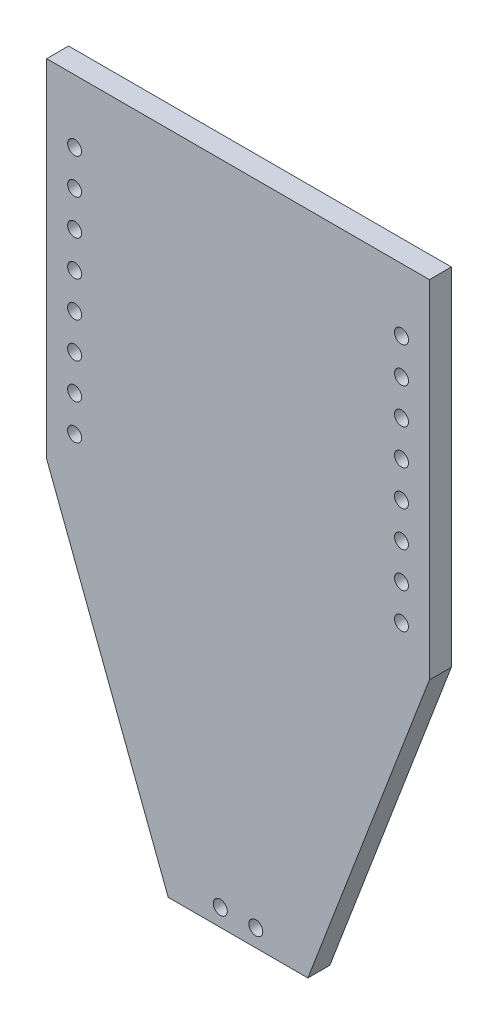
ISO-10303-21;
HEADER;
FILE_DESCRIPTION(('STEP AP214'),'2;1');
FILE_NAME('part.step','',(''),(''),'','','');
FILE_SCHEMA(('AUTOMOTIVE_DESIGN { 1 0 10303 214 1 1 1 1 }'));
ENDSEC;
DATA;
#1=APPLICATION_CONTEXT('core data for automotive mechanical design processes');
#2=APPLICATION_PROTOCOL_DEFINITION('international standard','automotive_design',2000,#1);
#3=PRODUCT_CONTEXT('',#1,'mechanical');
#4=PRODUCT('Part','Part','',(#3));
#5=PRODUCT_RELATED_PRODUCT_CATEGORY('part','',(#4));
#6=PRODUCT_DEFINITION_FORMATION('','',#4);
#7=PRODUCT_DEFINITION_CONTEXT('part definition',#1,'design');
#8=PRODUCT_DEFINITION('design','',#6,#7);
#9=PRODUCT_DEFINITION_SHAPE('','',#8);
#10=(LENGTH_UNIT() NAMED_UNIT(*) SI_UNIT(.MILLI.,.METRE.));
#11=(NAMED_UNIT(*) PLANE_ANGLE_UNIT() SI_UNIT($,.RADIAN.));
#12=(NAMED_UNIT(*) SI_UNIT($,.STERADIAN.) SOLID_ANGLE_UNIT());
#13=UNCERTAINTY_MEASURE_WITH_UNIT(LENGTH_MEASURE(1.E-05),#10,'distance_accuracy_value','');
#14=(GEOMETRIC_REPRESENTATION_CONTEXT(3) GLOBAL_UNCERTAINTY_ASSIGNED_CONTEXT((#13)) GLOBAL_UNIT_ASSIGNED_CONTEXT((#10,
#11,#12)) REPRESENTATION_CONTEXT('',''));
#15=CARTESIAN_POINT('',(0.,0.,0.));
#16=DIRECTION('',(0.,0.,1.));
#17=DIRECTION('',(1.,0.,0.));
#18=AXIS2_PLACEMENT_3D('',#15,#16,#17);
#19=CARTESIAN_POINT('',(0.,-27.8,1.57));
#20=DIRECTION('',(0.,1.,0.));
#21=DIRECTION('',(0.,0.,1.));
#22=AXIS2_PLACEMENT_3D('',#19,#20,#21);
#23=PLANE('',#22);
#24=DIRECTION('',(1.,0.,0.));
#25=VECTOR('',#24,1.);
#26=CARTESIAN_POINT('',(0.,-27.8,0.));
#27=LINE('',#26,#25);
#28=CARTESIAN_POINT('',(-5.,-27.8,0.));
#29=VERTEX_POINT('',#28);
#30=CARTESIAN_POINT('',(5.00000000000001,-27.8,0.));
#31=VERTEX_POINT('',#30);
#32=EDGE_CURVE('E179',#29,#31,#27,.T.);
#33=ORIENTED_EDGE('',*,*,#32,.T.);
#34=DIRECTION('',(0.,0.,-1.));
#35=VECTOR('',#34,1.);
#36=CARTESIAN_POINT('',(5.00000000000001,-27.8,1.57));
#37=LINE('',#36,#35);
#38=CARTESIAN_POINT('',(5.00000000000001,-27.8,1.57));
#39=VERTEX_POINT('',#38);
#40=EDGE_CURVE('E11',#39,#31,#37,.T.);
#41=ORIENTED_EDGE('',*,*,#40,.F.);
#42=DIRECTION('',(1.,0.,0.));
#43=VECTOR('',#42,1.);
#44=CARTESIAN_POINT('',(0.,-27.8,1.57));
#45=LINE('',#44,#43);
#46=CARTESIAN_POINT('',(-5.,-27.8,1.57));
#47=VERTEX_POINT('',#46);
#48=EDGE_CURVE('E244',#47,#39,#45,.T.);
#49=ORIENTED_EDGE('',*,*,#48,.F.);
#50=DIRECTION('',(0.,0.,-1.));
#51=VECTOR('',#50,1.);
#52=CARTESIAN_POINT('',(-5.,-27.8,1.57));
#53=LINE('',#52,#51);
#54=EDGE_CURVE('E178',#47,#29,#53,.T.);
#55=ORIENTED_EDGE('',*,*,#54,.T.);
#56=EDGE_LOOP('',(#33,#41,#49,#55));
#57=FACE_BOUND('',#56,.T.);
#58=ADVANCED_FACE('F41',(#57),#23,.F.);
#59=CARTESIAN_POINT('',(13.6165576783606,-5.18896416126752,1.57));
#60=DIRECTION('',(-0.934448824881694,0.356097449692104,0.));
#61=DIRECTION('',(-0.356097449692104,-0.934448824881694,0.));
#62=AXIS2_PLACEMENT_3D('',#59,#60,#61);
#63=PLANE('',#62);
#64=DIRECTION('',(0.356097449692104,0.934448824881694,0.));
#65=VECTOR('',#64,1.);
#66=CARTESIAN_POINT('',(13.6165576783606,-5.18896416126752,0.));
#67=LINE('',#66,#65);
#68=CARTESIAN_POINT('',(13.7,-4.97000000000002,0.));
#69=VERTEX_POINT('',#68);
#70=EDGE_CURVE('E182',#31,#69,#67,.T.);
#71=ORIENTED_EDGE('',*,*,#70,.T.);
#72=DIRECTION('',(0.,0.,-1.));
#73=VECTOR('',#72,1.);
#74=CARTESIAN_POINT('',(13.7,-4.97000000000002,1.57));
#75=LINE('',#74,#73);
#76=CARTESIAN_POINT('',(13.7,-4.97000000000002,1.57));
#77=VERTEX_POINT('',#76);
#78=EDGE_CURVE('E49',#77,#69,#75,.T.);
#79=ORIENTED_EDGE('',*,*,#78,.F.);
#80=DIRECTION('',(0.356097449692104,0.934448824881694,0.));
#81=VECTOR('',#80,1.);
#82=CARTESIAN_POINT('',(13.6165576783606,-5.18896416126752,1.57));
#83=LINE('',#82,#81);
#84=EDGE_CURVE('E90',#39,#77,#83,.T.);
#85=ORIENTED_EDGE('',*,*,#84,.F.);
#86=ORIENTED_EDGE('',*,*,#40,.T.);
#87=EDGE_LOOP('',(#71,#79,#85,#86));
#88=FACE_BOUND('',#87,.T.);
#89=ADVANCED_FACE('F274',(#88),#63,.F.);
#90=CARTESIAN_POINT('',(13.7,0.,1.57));
#91=DIRECTION('',(-1.,0.,0.));
#92=DIRECTION('',(0.,0.,1.));
#93=AXIS2_PLACEMENT_3D('',#90,#91,#92);
#94=PLANE('',#93);
#95=DIRECTION('',(0.,1.,0.));
#96=VECTOR('',#95,1.);
#97=CARTESIAN_POINT('',(13.7,0.,0.));
#98=LINE('',#97,#96);
#99=CARTESIAN_POINT('',(13.7,19.85,0.));
#100=VERTEX_POINT('',#99);
#101=EDGE_CURVE('E184',#69,#100,#98,.T.);
#102=ORIENTED_EDGE('',*,*,#101,.T.);
#103=DIRECTION('',(0.,0.,-1.));
#104=VECTOR('',#103,1.);
#105=CARTESIAN_POINT('',(13.7,19.85,1.57));
#106=LINE('',#105,#104);
#107=CARTESIAN_POINT('',(13.7,19.85,1.57));
#108=VERTEX_POINT('',#107);
#109=EDGE_CURVE('E117',#108,#100,#106,.T.);
#110=ORIENTED_EDGE('',*,*,#109,.F.);
#111=DIRECTION('',(0.,1.,0.));
#112=VECTOR('',#111,1.);
#113=CARTESIAN_POINT('',(13.7,0.,1.57));
#114=LINE('',#113,#112);
#115=EDGE_CURVE('E104',#77,#108,#114,.T.);
#116=ORIENTED_EDGE('',*,*,#115,.F.);
#117=ORIENTED_EDGE('',*,*,#78,.T.);
#118=EDGE_LOOP('',(#102,#110,#116,#117));
#119=FACE_BOUND('',#118,.T.);
#120=ADVANCED_FACE('F250',(#119),#94,.F.);
#121=CARTESIAN_POINT('',(0.,19.85,1.57));
#122=DIRECTION('',(0.,-1.,0.));
#123=DIRECTION('',(1.,0.,0.));
#124=AXIS2_PLACEMENT_3D('',#121,#122,#123);
#125=PLANE('',#124);
#126=DIRECTION('',(-1.,0.,0.));
#127=VECTOR('',#126,1.);
#128=CARTESIAN_POINT('',(0.,19.85,0.));
#129=LINE('',#128,#127);
#130=CARTESIAN_POINT('',(-13.7,19.85,0.));
#131=VERTEX_POINT('',#130);
#132=EDGE_CURVE('E113',#100,#131,#129,.T.);
#133=ORIENTED_EDGE('',*,*,#132,.T.);
#134=DIRECTION('',(0.,0.,-1.));
#135=VECTOR('',#134,1.);
#136=CARTESIAN_POINT('',(-13.7,19.85,1.57));
#137=LINE('',#136,#135);
#138=CARTESIAN_POINT('',(-13.7,19.85,1.57));
#139=VERTEX_POINT('',#138);
#140=EDGE_CURVE('E110',#139,#131,#137,.T.);
#141=ORIENTED_EDGE('',*,*,#140,.F.);
#142=DIRECTION('',(-1.,0.,0.));
#143=VECTOR('',#142,1.);
#144=CARTESIAN_POINT('',(0.,19.85,1.57));
#145=LINE('',#144,#143);
#146=EDGE_CURVE('E97',#108,#139,#145,.T.);
#147=ORIENTED_EDGE('',*,*,#146,.F.);
#148=ORIENTED_EDGE('',*,*,#109,.T.);
#149=EDGE_LOOP('',(#133,#141,#147,#148));
#150=FACE_BOUND('',#149,.T.);
#151=ADVANCED_FACE('F111',(#150),#125,.F.);
#152=CARTESIAN_POINT('',(-13.7,0.,1.57));
#153=DIRECTION('',(-1.,0.,0.));
#154=DIRECTION('',(0.,0.,1.));
#155=AXIS2_PLACEMENT_3D('',#152,#153,#154);
#156=PLANE('',#155);
#157=DIRECTION('',(0.,1.,0.));
#158=VECTOR('',#157,1.);
#159=CARTESIAN_POINT('',(-13.7,0.,0.));
#160=LINE('',#159,#158);
#161=CARTESIAN_POINT('',(-13.7,-4.97000000000002,0.));
#162=VERTEX_POINT('',#161);
#163=EDGE_CURVE('E187',#162,#131,#160,.T.);
#164=ORIENTED_EDGE('',*,*,#163,.F.);
#165=DIRECTION('',(0.,0.,-1.));
#166=VECTOR('',#165,1.);
#167=CARTESIAN_POINT('',(-13.7,-4.97000000000002,1.57));
#168=LINE('',#167,#166);
#169=CARTESIAN_POINT('',(-13.7,-4.97000000000002,1.57));
#170=VERTEX_POINT('',#169);
#171=EDGE_CURVE('E79',#170,#162,#168,.T.);
#172=ORIENTED_EDGE('',*,*,#171,.F.);
#173=DIRECTION('',(0.,1.,0.));
#174=VECTOR('',#173,1.);
#175=CARTESIAN_POINT('',(-13.7,0.,1.57));
#176=LINE('',#175,#174);
#177=EDGE_CURVE('E102',#170,#139,#176,.T.);
#178=ORIENTED_EDGE('',*,*,#177,.T.);
#179=ORIENTED_EDGE('',*,*,#140,.T.);
#180=EDGE_LOOP('',(#164,#172,#178,#179));
#181=FACE_BOUND('',#180,.T.);
#182=ADVANCED_FACE('F119',(#181),#156,.T.);
#183=CARTESIAN_POINT('',(1.27000000000001,-26.55,1.57));
#184=DIRECTION('',(0.,0.,-1.));
#185=DIRECTION('',(-1.,0.,0.));
#186=AXIS2_PLACEMENT_3D('',#183,#184,#185);
#187=CYLINDRICAL_SURFACE('',#186,0.5);
#188=CARTESIAN_POINT('',(1.27000000000001,-26.55,1.57));
#189=DIRECTION('',(0.,0.,1.));
#190=DIRECTION('',(1.,0.,0.));
#191=AXIS2_PLACEMENT_3D('',#188,#189,#190);
#192=CIRCLE('',#191,0.5);
#193=CARTESIAN_POINT('',(1.77000000000001,-26.55,1.57));
#194=VERTEX_POINT('',#193);
#195=EDGE_CURVE('E172',#194,#194,#192,.T.);
#196=ORIENTED_EDGE('',*,*,#195,.T.);
#197=EDGE_LOOP('',(#196));
#198=FACE_BOUND('',#197,.T.);
#199=CARTESIAN_POINT('',(1.27000000000001,-26.55,0.));
#200=DIRECTION('',(0.,0.,1.));
#201=DIRECTION('',(1.,0.,0.));
#202=AXIS2_PLACEMENT_3D('',#199,#200,#201);
#203=CIRCLE('',#202,0.5);
#204=CARTESIAN_POINT('',(1.77000000000001,-26.55,0.));
#205=VERTEX_POINT('',#204);
#206=EDGE_CURVE('E238',#205,#205,#203,.T.);
#207=ORIENTED_EDGE('',*,*,#206,.F.);
#208=EDGE_LOOP('',(#207));
#209=FACE_BOUND('',#208,.T.);
#210=ADVANCED_FACE('F285',(#198,#209),#187,.F.);
#211=CARTESIAN_POINT('',(11.7,15.35,1.57));
#212=DIRECTION('',(0.,0.,-1.));
#213=DIRECTION('',(-1.,0.,0.));
#214=AXIS2_PLACEMENT_3D('',#211,#212,#213);
#215=CYLINDRICAL_SURFACE('',#214,0.500000000000001);
#216=CARTESIAN_POINT('',(11.7,15.35,1.57));
#217=DIRECTION('',(0.,0.,1.));
#218=DIRECTION('',(1.,0.,0.));
#219=AXIS2_PLACEMENT_3D('',#216,#217,#218);
#220=CIRCLE('',#219,0.500000000000001);
#221=CARTESIAN_POINT('',(12.2,15.35,1.57));
#222=VERTEX_POINT('',#221);
#223=EDGE_CURVE('E169',#222,#222,#220,.F.);
#224=ORIENTED_EDGE('',*,*,#223,.F.);
#225=EDGE_LOOP('',(#224));
#226=FACE_BOUND('',#225,.T.);
#227=CARTESIAN_POINT('',(11.7,15.35,0.));
#228=DIRECTION('',(0.,0.,1.));
#229=DIRECTION('',(1.,0.,0.));
#230=AXIS2_PLACEMENT_3D('',#227,#228,#229);
#231=CIRCLE('',#230,0.500000000000001);
#232=CARTESIAN_POINT('',(12.2,15.35,0.));
#233=VERTEX_POINT('',#232);
#234=EDGE_CURVE('E235',#233,#233,#231,.F.);
#235=ORIENTED_EDGE('',*,*,#234,.T.);
#236=EDGE_LOOP('',(#235));
#237=FACE_BOUND('',#236,.T.);
#238=ADVANCED_FACE('F289',(#226,#237),#215,.F.);
#239=CARTESIAN_POINT('',(11.7,10.27,1.57));
#240=DIRECTION('',(0.,0.,-1.));
#241=DIRECTION('',(-1.,0.,0.));
#242=AXIS2_PLACEMENT_3D('',#239,#240,#241);
#243=CYLINDRICAL_SURFACE('',#242,0.500000000000001);
#244=CARTESIAN_POINT('',(11.7,10.27,1.57));
#245=DIRECTION('',(0.,0.,1.));
#246=DIRECTION('',(1.,0.,0.));
#247=AXIS2_PLACEMENT_3D('',#244,#245,#246);
#248=CIRCLE('',#247,0.500000000000001);
#249=CARTESIAN_POINT('',(12.2,10.27,1.57));
#250=VERTEX_POINT('',#249);
#251=EDGE_CURVE('E166',#250,#250,#248,.F.);
#252=ORIENTED_EDGE('',*,*,#251,.F.);
#253=EDGE_LOOP('',(#252));
#254=FACE_BOUND('',#253,.T.);
#255=CARTESIAN_POINT('',(11.7,10.27,0.));
#256=DIRECTION('',(0.,0.,1.));
#257=DIRECTION('',(1.,0.,0.));
#258=AXIS2_PLACEMENT_3D('',#255,#256,#257);
#259=CIRCLE('',#258,0.500000000000001);
#260=CARTESIAN_POINT('',(12.2,10.27,0.));
#261=VERTEX_POINT('',#260);
#262=EDGE_CURVE('E232',#261,#261,#259,.F.);
#263=ORIENTED_EDGE('',*,*,#262,.T.);
#264=EDGE_LOOP('',(#263));
#265=FACE_BOUND('',#264,.T.);
#266=ADVANCED_FACE('F295',(#254,#265),#243,.F.);
#267=CARTESIAN_POINT('',(11.6999999999999,5.19,1.57));
#268=DIRECTION('',(0.,0.,-1.));
#269=DIRECTION('',(-1.,0.,0.));
#270=AXIS2_PLACEMENT_3D('',#267,#268,#269);
#271=CYLINDRICAL_SURFACE('',#270,0.500000000000001);
#272=CARTESIAN_POINT('',(11.6999999999999,5.19,1.57));
#273=DIRECTION('',(0.,0.,1.));
#274=DIRECTION('',(1.,0.,0.));
#275=AXIS2_PLACEMENT_3D('',#272,#273,#274);
#276=CIRCLE('',#275,0.500000000000001);
#277=CARTESIAN_POINT('',(12.1999999999999,5.19,1.57));
#278=VERTEX_POINT('',#277);
#279=EDGE_CURVE('E163',#278,#278,#276,.F.);
#280=ORIENTED_EDGE('',*,*,#279,.F.);
#281=EDGE_LOOP('',(#280));
#282=FACE_BOUND('',#281,.T.);
#283=CARTESIAN_POINT('',(11.6999999999999,5.19,0.));
#284=DIRECTION('',(0.,0.,1.));
#285=DIRECTION('',(1.,0.,0.));
#286=AXIS2_PLACEMENT_3D('',#283,#284,#285);
#287=CIRCLE('',#286,0.500000000000001);
#288=CARTESIAN_POINT('',(12.1999999999999,5.19,0.));
#289=VERTEX_POINT('',#288);
#290=EDGE_CURVE('E229',#289,#289,#287,.F.);
#291=ORIENTED_EDGE('',*,*,#290,.T.);
#292=EDGE_LOOP('',(#291));
#293=FACE_BOUND('',#292,.T.);
#294=ADVANCED_FACE('F303',(#282,#293),#271,.F.);
#295=CARTESIAN_POINT('',(11.6999999999999,0.110000000000002,1.57));
#296=DIRECTION('',(0.,0.,-1.));
#297=DIRECTION('',(-1.,0.,0.));
#298=AXIS2_PLACEMENT_3D('',#295,#296,#297);
#299=CYLINDRICAL_SURFACE('',#298,0.500000000000001);
#300=CARTESIAN_POINT('',(11.6999999999999,0.110000000000002,1.57));
#301=DIRECTION('',(0.,0.,1.));
#302=DIRECTION('',(1.,0.,0.));
#303=AXIS2_PLACEMENT_3D('',#300,#301,#302);
#304=CIRCLE('',#303,0.500000000000001);
#305=CARTESIAN_POINT('',(12.1999999999999,0.110000000000002,1.57));
#306=VERTEX_POINT('',#305);
#307=EDGE_CURVE('E160',#306,#306,#304,.F.);
#308=ORIENTED_EDGE('',*,*,#307,.F.);
#309=EDGE_LOOP('',(#308));
#310=FACE_BOUND('',#309,.T.);
#311=CARTESIAN_POINT('',(11.6999999999999,0.110000000000002,0.));
#312=DIRECTION('',(0.,0.,1.));
#313=DIRECTION('',(1.,0.,0.));
#314=AXIS2_PLACEMENT_3D('',#311,#312,#313);
#315=CIRCLE('',#314,0.500000000000001);
#316=CARTESIAN_POINT('',(12.1999999999999,0.110000000000002,0.));
#317=VERTEX_POINT('',#316);
#318=EDGE_CURVE('E226',#317,#317,#315,.F.);
#319=ORIENTED_EDGE('',*,*,#318,.T.);
#320=EDGE_LOOP('',(#319));
#321=FACE_BOUND('',#320,.T.);
#322=ADVANCED_FACE('F307',(#310,#321),#299,.F.);
#323=CARTESIAN_POINT('',(11.6999999999998,-2.43,1.57));
#324=DIRECTION('',(0.,0.,-1.));
#325=DIRECTION('',(-1.,0.,0.));
#326=AXIS2_PLACEMENT_3D('',#323,#324,#325);
#327=CYLINDRICAL_SURFACE('',#326,0.500000000000001);
#328=CARTESIAN_POINT('',(11.6999999999998,-2.43,1.57));
#329=DIRECTION('',(0.,0.,1.));
#330=DIRECTION('',(1.,0.,0.));
#331=AXIS2_PLACEMENT_3D('',#328,#329,#330);
#332=CIRCLE('',#331,0.500000000000001);
#333=CARTESIAN_POINT('',(12.1999999999998,-2.43,1.57));
#334=VERTEX_POINT('',#333);
#335=EDGE_CURVE('E157',#334,#334,#332,.F.);
#336=ORIENTED_EDGE('',*,*,#335,.F.);
#337=EDGE_LOOP('',(#336));
#338=FACE_BOUND('',#337,.T.);
#339=CARTESIAN_POINT('',(11.6999999999998,-2.43,0.));
#340=DIRECTION('',(0.,0.,1.));
#341=DIRECTION('',(1.,0.,0.));
#342=AXIS2_PLACEMENT_3D('',#339,#340,#341);
#343=CIRCLE('',#342,0.500000000000001);
#344=CARTESIAN_POINT('',(12.1999999999998,-2.43,0.));
#345=VERTEX_POINT('',#344);
#346=EDGE_CURVE('E223',#345,#345,#343,.F.);
#347=ORIENTED_EDGE('',*,*,#346,.T.);
#348=EDGE_LOOP('',(#347));
#349=FACE_BOUND('',#348,.T.);
#350=ADVANCED_FACE('F311',(#338,#349),#327,.F.);
#351=CARTESIAN_POINT('',(11.6999999999999,2.65,1.57));
#352=DIRECTION('',(0.,0.,-1.));
#353=DIRECTION('',(-1.,0.,0.));
#354=AXIS2_PLACEMENT_3D('',#351,#352,#353);
#355=CYLINDRICAL_SURFACE('',#354,0.500000000000001);
#356=CARTESIAN_POINT('',(11.6999999999999,2.65,1.57));
#357=DIRECTION('',(0.,0.,1.));
#358=DIRECTION('',(1.,0.,0.));
#359=AXIS2_PLACEMENT_3D('',#356,#357,#358);
#360=CIRCLE('',#359,0.500000000000001);
#361=CARTESIAN_POINT('',(12.1999999999999,2.65,1.57));
#362=VERTEX_POINT('',#361);
#363=EDGE_CURVE('E154',#362,#362,#360,.F.);
#364=ORIENTED_EDGE('',*,*,#363,.F.);
#365=EDGE_LOOP('',(#364));
#366=FACE_BOUND('',#365,.T.);
#367=CARTESIAN_POINT('',(11.6999999999999,2.65,0.));
#368=DIRECTION('',(0.,0.,1.));
#369=DIRECTION('',(1.,0.,0.));
#370=AXIS2_PLACEMENT_3D('',#367,#368,#369);
#371=CIRCLE('',#370,0.500000000000001);
#372=CARTESIAN_POINT('',(12.1999999999999,2.65,0.));
#373=VERTEX_POINT('',#372);
#374=EDGE_CURVE('E220',#373,#373,#371,.F.);
#375=ORIENTED_EDGE('',*,*,#374,.T.);
#376=EDGE_LOOP('',(#375));
#377=FACE_BOUND('',#376,.T.);
#378=ADVANCED_FACE('F315',(#366,#377),#355,.F.);
#379=CARTESIAN_POINT('',(11.6999999999999,7.73,1.57));
#380=DIRECTION('',(0.,0.,-1.));
#381=DIRECTION('',(-1.,0.,0.));
#382=AXIS2_PLACEMENT_3D('',#379,#380,#381);
#383=CYLINDRICAL_SURFACE('',#382,0.500000000000001);
#384=CARTESIAN_POINT('',(11.6999999999999,7.73,1.57));
#385=DIRECTION('',(0.,0.,1.));
#386=DIRECTION('',(1.,0.,0.));
#387=AXIS2_PLACEMENT_3D('',#384,#385,#386);
#388=CIRCLE('',#387,0.500000000000001);
#389=CARTESIAN_POINT('',(12.1999999999999,7.73,1.57));
#390=VERTEX_POINT('',#389);
#391=EDGE_CURVE('E151',#390,#390,#388,.F.);
#392=ORIENTED_EDGE('',*,*,#391,.F.);
#393=EDGE_LOOP('',(#392));
#394=FACE_BOUND('',#393,.T.);
#395=CARTESIAN_POINT('',(11.6999999999999,7.73,0.));
#396=DIRECTION('',(0.,0.,1.));
#397=DIRECTION('',(1.,0.,0.));
#398=AXIS2_PLACEMENT_3D('',#395,#396,#397);
#399=CIRCLE('',#398,0.500000000000001);
#400=CARTESIAN_POINT('',(12.1999999999999,7.73,0.));
#401=VERTEX_POINT('',#400);
#402=EDGE_CURVE('E217',#401,#401,#399,.F.);
#403=ORIENTED_EDGE('',*,*,#402,.T.);
#404=EDGE_LOOP('',(#403));
#405=FACE_BOUND('',#404,.T.);
#406=ADVANCED_FACE('F319',(#394,#405),#383,.F.);
#407=CARTESIAN_POINT('',(11.7,12.81,1.57));
#408=DIRECTION('',(0.,0.,-1.));
#409=DIRECTION('',(-1.,0.,0.));
#410=AXIS2_PLACEMENT_3D('',#407,#408,#409);
#411=CYLINDRICAL_SURFACE('',#410,0.500000000000001);
#412=CARTESIAN_POINT('',(11.7,12.81,1.57));
#413=DIRECTION('',(0.,0.,1.));
#414=DIRECTION('',(1.,0.,0.));
#415=AXIS2_PLACEMENT_3D('',#412,#413,#414);
#416=CIRCLE('',#415,0.500000000000001);
#417=CARTESIAN_POINT('',(12.2,12.81,1.57));
#418=VERTEX_POINT('',#417);
#419=EDGE_CURVE('E148',#418,#418,#416,.F.);
#420=ORIENTED_EDGE('',*,*,#419,.F.);
#421=EDGE_LOOP('',(#420));
#422=FACE_BOUND('',#421,.T.);
#423=CARTESIAN_POINT('',(11.7,12.81,0.));
#424=DIRECTION('',(0.,0.,1.));
#425=DIRECTION('',(1.,0.,0.));
#426=AXIS2_PLACEMENT_3D('',#423,#424,#425);
#427=CIRCLE('',#426,0.500000000000001);
#428=CARTESIAN_POINT('',(12.2,12.81,0.));
#429=VERTEX_POINT('',#428);
#430=EDGE_CURVE('E214',#429,#429,#427,.F.);
#431=ORIENTED_EDGE('',*,*,#430,.T.);
#432=EDGE_LOOP('',(#431));
#433=FACE_BOUND('',#432,.T.);
#434=ADVANCED_FACE('F323',(#422,#433),#411,.F.);
#435=CARTESIAN_POINT('',(-11.7,15.35,1.57));
#436=DIRECTION('',(0.,0.,-1.));
#437=DIRECTION('',(-1.,0.,0.));
#438=AXIS2_PLACEMENT_3D('',#435,#436,#437);
#439=CYLINDRICAL_SURFACE('',#438,0.500000000000001);
#440=CARTESIAN_POINT('',(-11.7,15.35,1.57));
#441=DIRECTION('',(0.,0.,1.));
#442=DIRECTION('',(1.,0.,0.));
#443=AXIS2_PLACEMENT_3D('',#440,#441,#442);
#444=CIRCLE('',#443,0.500000000000001);
#445=CARTESIAN_POINT('',(-11.2,15.35,1.57));
#446=VERTEX_POINT('',#445);
#447=EDGE_CURVE('E145',#446,#446,#444,.T.);
#448=ORIENTED_EDGE('',*,*,#447,.T.);
#449=EDGE_LOOP('',(#448));
#450=FACE_BOUND('',#449,.T.);
#451=CARTESIAN_POINT('',(-11.7,15.35,0.));
#452=DIRECTION('',(0.,0.,1.));
#453=DIRECTION('',(1.,0.,0.));
#454=AXIS2_PLACEMENT_3D('',#451,#452,#453);
#455=CIRCLE('',#454,0.500000000000001);
#456=CARTESIAN_POINT('',(-11.2,15.35,0.));
#457=VERTEX_POINT('',#456);
#458=EDGE_CURVE('E211',#457,#457,#455,.T.);
#459=ORIENTED_EDGE('',*,*,#458,.F.);
#460=EDGE_LOOP('',(#459));
#461=FACE_BOUND('',#460,.T.);
#462=ADVANCED_FACE('F327',(#450,#461),#439,.F.);
#463=CARTESIAN_POINT('',(-11.7,12.81,1.57));
#464=DIRECTION('',(0.,0.,-1.));
#465=DIRECTION('',(-1.,0.,0.));
#466=AXIS2_PLACEMENT_3D('',#463,#464,#465);
#467=CYLINDRICAL_SURFACE('',#466,0.500000000000001);
#468=CARTESIAN_POINT('',(-11.7,12.81,1.57));
#469=DIRECTION('',(0.,0.,1.));
#470=DIRECTION('',(1.,0.,0.));
#471=AXIS2_PLACEMENT_3D('',#468,#469,#470);
#472=CIRCLE('',#471,0.500000000000001);
#473=CARTESIAN_POINT('',(-11.2,12.81,1.57));
#474=VERTEX_POINT('',#473);
#475=EDGE_CURVE('E142',#474,#474,#472,.T.);
#476=ORIENTED_EDGE('',*,*,#475,.T.);
#477=EDGE_LOOP('',(#476));
#478=FACE_BOUND('',#477,.T.);
#479=CARTESIAN_POINT('',(-11.7,12.81,0.));
#480=DIRECTION('',(0.,0.,1.));
#481=DIRECTION('',(1.,0.,0.));
#482=AXIS2_PLACEMENT_3D('',#479,#480,#481);
#483=CIRCLE('',#482,0.500000000000001);
#484=CARTESIAN_POINT('',(-11.2,12.81,0.));
#485=VERTEX_POINT('',#484);
#486=EDGE_CURVE('E208',#485,#485,#483,.T.);
#487=ORIENTED_EDGE('',*,*,#486,.F.);
#488=EDGE_LOOP('',(#487));
#489=FACE_BOUND('',#488,.T.);
#490=ADVANCED_FACE('F331',(#478,#489),#467,.F.);
#491=CARTESIAN_POINT('',(-11.6999999999999,10.27,1.57));
#492=DIRECTION('',(0.,0.,-1.));
#493=DIRECTION('',(-1.,0.,0.));
#494=AXIS2_PLACEMENT_3D('',#491,#492,#493);
#495=CYLINDRICAL_SURFACE('',#494,0.500000000000001);
#496=CARTESIAN_POINT('',(-11.6999999999999,10.27,1.57));
#497=DIRECTION('',(0.,0.,1.));
#498=DIRECTION('',(1.,0.,0.));
#499=AXIS2_PLACEMENT_3D('',#496,#497,#498);
#500=CIRCLE('',#499,0.500000000000001);
#501=CARTESIAN_POINT('',(-11.1999999999999,10.27,1.57));
#502=VERTEX_POINT('',#501);
#503=EDGE_CURVE('E139',#502,#502,#500,.T.);
#504=ORIENTED_EDGE('',*,*,#503,.T.);
#505=EDGE_LOOP('',(#504));
#506=FACE_BOUND('',#505,.T.);
#507=CARTESIAN_POINT('',(-11.6999999999999,10.27,0.));
#508=DIRECTION('',(0.,0.,1.));
#509=DIRECTION('',(1.,0.,0.));
#510=AXIS2_PLACEMENT_3D('',#507,#508,#509);
#511=CIRCLE('',#510,0.500000000000001);
#512=CARTESIAN_POINT('',(-11.1999999999999,10.27,0.));
#513=VERTEX_POINT('',#512);
#514=EDGE_CURVE('E205',#513,#513,#511,.T.);
#515=ORIENTED_EDGE('',*,*,#514,.F.);
#516=EDGE_LOOP('',(#515));
#517=FACE_BOUND('',#516,.T.);
#518=ADVANCED_FACE('F335',(#506,#517),#495,.F.);
#519=CARTESIAN_POINT('',(-11.6999999999999,7.73,1.57));
#520=DIRECTION('',(0.,0.,-1.));
#521=DIRECTION('',(-1.,0.,0.));
#522=AXIS2_PLACEMENT_3D('',#519,#520,#521);
#523=CYLINDRICAL_SURFACE('',#522,0.500000000000001);
#524=CARTESIAN_POINT('',(-11.6999999999999,7.73,1.57));
#525=DIRECTION('',(0.,0.,1.));
#526=DIRECTION('',(1.,0.,0.));
#527=AXIS2_PLACEMENT_3D('',#524,#525,#526);
#528=CIRCLE('',#527,0.500000000000001);
#529=CARTESIAN_POINT('',(-11.1999999999999,7.73,1.57));
#530=VERTEX_POINT('',#529);
#531=EDGE_CURVE('E136',#530,#530,#528,.T.);
#532=ORIENTED_EDGE('',*,*,#531,.T.);
#533=EDGE_LOOP('',(#532));
#534=FACE_BOUND('',#533,.T.);
#535=CARTESIAN_POINT('',(-11.6999999999999,7.73,0.));
#536=DIRECTION('',(0.,0.,1.));
#537=DIRECTION('',(1.,0.,0.));
#538=AXIS2_PLACEMENT_3D('',#535,#536,#537);
#539=CIRCLE('',#538,0.500000000000001);
#540=CARTESIAN_POINT('',(-11.1999999999999,7.73,0.));
#541=VERTEX_POINT('',#540);
#542=EDGE_CURVE('E202',#541,#541,#539,.T.);
#543=ORIENTED_EDGE('',*,*,#542,.F.);
#544=EDGE_LOOP('',(#543));
#545=FACE_BOUND('',#544,.T.);
#546=ADVANCED_FACE('F339',(#534,#545),#523,.F.);
#547=CARTESIAN_POINT('',(-11.6999999999999,5.19,1.57));
#548=DIRECTION('',(0.,0.,-1.));
#549=DIRECTION('',(-1.,0.,0.));
#550=AXIS2_PLACEMENT_3D('',#547,#548,#549);
#551=CYLINDRICAL_SURFACE('',#550,0.500000000000001);
#552=CARTESIAN_POINT('',(-11.6999999999999,5.19,1.57));
#553=DIRECTION('',(0.,0.,1.));
#554=DIRECTION('',(1.,0.,0.));
#555=AXIS2_PLACEMENT_3D('',#552,#553,#554);
#556=CIRCLE('',#555,0.500000000000001);
#557=CARTESIAN_POINT('',(-11.1999999999999,5.19,1.57));
#558=VERTEX_POINT('',#557);
#559=EDGE_CURVE('E133',#558,#558,#556,.T.);
#560=ORIENTED_EDGE('',*,*,#559,.T.);
#561=EDGE_LOOP('',(#560));
#562=FACE_BOUND('',#561,.T.);
#563=CARTESIAN_POINT('',(-11.6999999999999,5.19,0.));
#564=DIRECTION('',(0.,0.,1.));
#565=DIRECTION('',(1.,0.,0.));
#566=AXIS2_PLACEMENT_3D('',#563,#564,#565);
#567=CIRCLE('',#566,0.500000000000001);
#568=CARTESIAN_POINT('',(-11.1999999999999,5.19,0.));
#569=VERTEX_POINT('',#568);
#570=EDGE_CURVE('E199',#569,#569,#567,.T.);
#571=ORIENTED_EDGE('',*,*,#570,.F.);
#572=EDGE_LOOP('',(#571));
#573=FACE_BOUND('',#572,.T.);
#574=ADVANCED_FACE('F343',(#562,#573),#551,.F.);
#575=CARTESIAN_POINT('',(-11.6999999999999,2.65,1.57));
#576=DIRECTION('',(0.,0.,-1.));
#577=DIRECTION('',(-1.,0.,0.));
#578=AXIS2_PLACEMENT_3D('',#575,#576,#577);
#579=CYLINDRICAL_SURFACE('',#578,0.500000000000001);
#580=CARTESIAN_POINT('',(-11.6999999999999,2.65,1.57));
#581=DIRECTION('',(0.,0.,1.));
#582=DIRECTION('',(1.,0.,0.));
#583=AXIS2_PLACEMENT_3D('',#580,#581,#582);
#584=CIRCLE('',#583,0.500000000000001);
#585=CARTESIAN_POINT('',(-11.1999999999999,2.65,1.57));
#586=VERTEX_POINT('',#585);
#587=EDGE_CURVE('E130',#586,#586,#584,.T.);
#588=ORIENTED_EDGE('',*,*,#587,.T.);
#589=EDGE_LOOP('',(#588));
#590=FACE_BOUND('',#589,.T.);
#591=CARTESIAN_POINT('',(-11.6999999999999,2.65,0.));
#592=DIRECTION('',(0.,0.,1.));
#593=DIRECTION('',(1.,0.,0.));
#594=AXIS2_PLACEMENT_3D('',#591,#592,#593);
#595=CIRCLE('',#594,0.500000000000001);
#596=CARTESIAN_POINT('',(-11.1999999999999,2.65,0.));
#597=VERTEX_POINT('',#596);
#598=EDGE_CURVE('E196',#597,#597,#595,.T.);
#599=ORIENTED_EDGE('',*,*,#598,.F.);
#600=EDGE_LOOP('',(#599));
#601=FACE_BOUND('',#600,.T.);
#602=ADVANCED_FACE('F347',(#590,#601),#579,.F.);
#603=CARTESIAN_POINT('',(-11.6999999999998,0.110000000000002,1.57));
#604=DIRECTION('',(0.,0.,-1.));
#605=DIRECTION('',(-1.,0.,0.));
#606=AXIS2_PLACEMENT_3D('',#603,#604,#605);
#607=CYLINDRICAL_SURFACE('',#606,0.500000000000001);
#608=CARTESIAN_POINT('',(-11.6999999999998,0.110000000000002,1.57));
#609=DIRECTION('',(0.,0.,1.));
#610=DIRECTION('',(1.,0.,0.));
#611=AXIS2_PLACEMENT_3D('',#608,#609,#610);
#612=CIRCLE('',#611,0.500000000000001);
#613=CARTESIAN_POINT('',(-11.1999999999998,0.110000000000002,1.57));
#614=VERTEX_POINT('',#613);
#615=EDGE_CURVE('E127',#614,#614,#612,.T.);
#616=ORIENTED_EDGE('',*,*,#615,.T.);
#617=EDGE_LOOP('',(#616));
#618=FACE_BOUND('',#617,.T.);
#619=CARTESIAN_POINT('',(-11.6999999999998,0.110000000000002,0.));
#620=DIRECTION('',(0.,0.,1.));
#621=DIRECTION('',(1.,0.,0.));
#622=AXIS2_PLACEMENT_3D('',#619,#620,#621);
#623=CIRCLE('',#622,0.500000000000001);
#624=CARTESIAN_POINT('',(-11.1999999999998,0.110000000000002,0.));
#625=VERTEX_POINT('',#624);
#626=EDGE_CURVE('E193',#625,#625,#623,.T.);
#627=ORIENTED_EDGE('',*,*,#626,.F.);
#628=EDGE_LOOP('',(#627));
#629=FACE_BOUND('',#628,.T.);
#630=ADVANCED_FACE('F269',(#618,#629),#607,.F.);
#631=CARTESIAN_POINT('',(-11.6999999999998,-2.43,1.57));
#632=DIRECTION('',(0.,0.,-1.));
#633=DIRECTION('',(-1.,0.,0.));
#634=AXIS2_PLACEMENT_3D('',#631,#632,#633);
#635=CYLINDRICAL_SURFACE('',#634,0.500000000000001);
#636=CARTESIAN_POINT('',(-11.6999999999998,-2.43,1.57));
#637=DIRECTION('',(0.,0.,1.));
#638=DIRECTION('',(1.,0.,0.));
#639=AXIS2_PLACEMENT_3D('',#636,#637,#638);
#640=CIRCLE('',#639,0.500000000000001);
#641=CARTESIAN_POINT('',(-11.1999999999998,-2.43,1.57));
#642=VERTEX_POINT('',#641);
#643=EDGE_CURVE('E121',#642,#642,#640,.T.);
#644=ORIENTED_EDGE('',*,*,#643,.T.);
#645=EDGE_LOOP('',(#644));
#646=FACE_BOUND('',#645,.T.);
#647=CARTESIAN_POINT('',(-11.6999999999998,-2.43,0.));
#648=DIRECTION('',(0.,0.,1.));
#649=DIRECTION('',(1.,0.,0.));
#650=AXIS2_PLACEMENT_3D('',#647,#648,#649);
#651=CIRCLE('',#650,0.500000000000001);
#652=CARTESIAN_POINT('',(-11.1999999999998,-2.43,0.));
#653=VERTEX_POINT('',#652);
#654=EDGE_CURVE('E190',#653,#653,#651,.T.);
#655=ORIENTED_EDGE('',*,*,#654,.F.);
#656=EDGE_LOOP('',(#655));
#657=FACE_BOUND('',#656,.T.);
#658=ADVANCED_FACE('F261',(#646,#657),#635,.F.);
#659=CARTESIAN_POINT('',(-13.6165576783606,-5.18896416126751,1.57));
#660=DIRECTION('',(0.934448824881694,0.356097449692104,0.));
#661=DIRECTION('',(-0.356097449692104,0.934448824881694,0.));
#662=AXIS2_PLACEMENT_3D('',#659,#660,#661);
#663=PLANE('',#662);
#664=DIRECTION('',(0.356097449692104,-0.934448824881694,0.));
#665=VECTOR('',#664,1.);
#666=CARTESIAN_POINT('',(-13.6165576783606,-5.18896416126751,0.));
#667=LINE('',#666,#665);
#668=EDGE_CURVE('E82',#162,#29,#667,.T.);
#669=ORIENTED_EDGE('',*,*,#668,.T.);
#670=ORIENTED_EDGE('',*,*,#54,.F.);
#671=DIRECTION('',(0.356097449692104,-0.934448824881694,0.));
#672=VECTOR('',#671,1.);
#673=CARTESIAN_POINT('',(-13.6165576783606,-5.18896416126751,1.57));
#674=LINE('',#673,#672);
#675=EDGE_CURVE('E57',#170,#47,#674,.T.);
#676=ORIENTED_EDGE('',*,*,#675,.F.);
#677=ORIENTED_EDGE('',*,*,#171,.T.);
#678=EDGE_LOOP('',(#669,#670,#676,#677));
#679=FACE_BOUND('',#678,.T.);
#680=ADVANCED_FACE('F258',(#679),#663,.F.);
#681=CARTESIAN_POINT('',(-1.26999999999999,-26.55,1.57));
#682=DIRECTION('',(0.,0.,-1.));
#683=DIRECTION('',(-1.,0.,0.));
#684=AXIS2_PLACEMENT_3D('',#681,#682,#683);
#685=CYLINDRICAL_SURFACE('',#684,0.5);
#686=CARTESIAN_POINT('',(-1.26999999999999,-26.55,1.57));
#687=DIRECTION('',(0.,0.,1.));
#688=DIRECTION('',(1.,0.,0.));
#689=AXIS2_PLACEMENT_3D('',#686,#687,#688);
#690=CIRCLE('',#689,0.5);
#691=CARTESIAN_POINT('',(-0.769999999999993,-26.55,1.57));
#692=VERTEX_POINT('',#691);
#693=EDGE_CURVE('E175',#692,#692,#690,.T.);
#694=ORIENTED_EDGE('',*,*,#693,.T.);
#695=EDGE_LOOP('',(#694));
#696=FACE_BOUND('',#695,.T.);
#697=CARTESIAN_POINT('',(-1.26999999999999,-26.55,0.));
#698=DIRECTION('',(0.,0.,1.));
#699=DIRECTION('',(1.,0.,0.));
#700=AXIS2_PLACEMENT_3D('',#697,#698,#699);
#701=CIRCLE('',#700,0.5);
#702=CARTESIAN_POINT('',(-0.769999999999993,-26.55,0.));
#703=VERTEX_POINT('',#702);
#704=EDGE_CURVE('E241',#703,#703,#701,.T.);
#705=ORIENTED_EDGE('',*,*,#704,.F.);
#706=EDGE_LOOP('',(#705));
#707=FACE_BOUND('',#706,.T.);
#708=ADVANCED_FACE('F260',(#696,#707),#685,.F.);
#709=CARTESIAN_POINT('',(0.,0.,1.57));
#710=DIRECTION('',(0.,0.,1.));
#711=DIRECTION('',(1.,0.,0.));
#712=AXIS2_PLACEMENT_3D('',#709,#710,#711);
#713=PLANE('',#712);
#714=ORIENTED_EDGE('',*,*,#48,.T.);
#715=ORIENTED_EDGE('',*,*,#84,.T.);
#716=ORIENTED_EDGE('',*,*,#115,.T.);
#717=ORIENTED_EDGE('',*,*,#146,.T.);
#718=ORIENTED_EDGE('',*,*,#177,.F.);
#719=ORIENTED_EDGE('',*,*,#675,.T.);
#720=EDGE_LOOP('',(#714,#715,#716,#717,#718,#719));
#721=FACE_BOUND('',#720,.T.);
#722=ORIENTED_EDGE('',*,*,#643,.F.);
#723=EDGE_LOOP('',(#722));
#724=FACE_BOUND('',#723,.T.);
#725=ORIENTED_EDGE('',*,*,#615,.F.);
#726=EDGE_LOOP('',(#725));
#727=FACE_BOUND('',#726,.T.);
#728=ORIENTED_EDGE('',*,*,#587,.F.);
#729=EDGE_LOOP('',(#728));
#730=FACE_BOUND('',#729,.T.);
#731=ORIENTED_EDGE('',*,*,#559,.F.);
#732=EDGE_LOOP('',(#731));
#733=FACE_BOUND('',#732,.T.);
#734=ORIENTED_EDGE('',*,*,#531,.F.);
#735=EDGE_LOOP('',(#734));
#736=FACE_BOUND('',#735,.T.);
#737=ORIENTED_EDGE('',*,*,#503,.F.);
#738=EDGE_LOOP('',(#737));
#739=FACE_BOUND('',#738,.T.);
#740=ORIENTED_EDGE('',*,*,#475,.F.);
#741=EDGE_LOOP('',(#740));
#742=FACE_BOUND('',#741,.T.);
#743=ORIENTED_EDGE('',*,*,#447,.F.);
#744=EDGE_LOOP('',(#743));
#745=FACE_BOUND('',#744,.T.);
#746=ORIENTED_EDGE('',*,*,#419,.T.);
#747=EDGE_LOOP('',(#746));
#748=FACE_BOUND('',#747,.T.);
#749=ORIENTED_EDGE('',*,*,#391,.T.);
#750=EDGE_LOOP('',(#749));
#751=FACE_BOUND('',#750,.T.);
#752=ORIENTED_EDGE('',*,*,#363,.T.);
#753=EDGE_LOOP('',(#752));
#754=FACE_BOUND('',#753,.T.);
#755=ORIENTED_EDGE('',*,*,#335,.T.);
#756=EDGE_LOOP('',(#755));
#757=FACE_BOUND('',#756,.T.);
#758=ORIENTED_EDGE('',*,*,#307,.T.);
#759=EDGE_LOOP('',(#758));
#760=FACE_BOUND('',#759,.T.);
#761=ORIENTED_EDGE('',*,*,#279,.T.);
#762=EDGE_LOOP('',(#761));
#763=FACE_BOUND('',#762,.T.);
#764=ORIENTED_EDGE('',*,*,#251,.T.);
#765=EDGE_LOOP('',(#764));
#766=FACE_BOUND('',#765,.T.);
#767=ORIENTED_EDGE('',*,*,#223,.T.);
#768=EDGE_LOOP('',(#767));
#769=FACE_BOUND('',#768,.T.);
#770=ORIENTED_EDGE('',*,*,#195,.F.);
#771=EDGE_LOOP('',(#770));
#772=FACE_BOUND('',#771,.T.);
#773=ORIENTED_EDGE('',*,*,#693,.F.);
#774=EDGE_LOOP('',(#773));
#775=FACE_BOUND('',#774,.T.);
#776=ADVANCED_FACE('F99',(#721,#724,#727,#730,#733,#736,#739,#742,#745,#748,#751,#754,#757,#760,
#763,#766,#769,#772,#775),#713,.T.);
#777=CARTESIAN_POINT('',(0.,0.,0.));
#778=DIRECTION('',(0.,0.,1.));
#779=DIRECTION('',(1.,0.,0.));
#780=AXIS2_PLACEMENT_3D('',#777,#778,#779);
#781=PLANE('',#780);
#782=ORIENTED_EDGE('',*,*,#32,.F.);
#783=ORIENTED_EDGE('',*,*,#668,.F.);
#784=ORIENTED_EDGE('',*,*,#163,.T.);
#785=ORIENTED_EDGE('',*,*,#132,.F.);
#786=ORIENTED_EDGE('',*,*,#101,.F.);
#787=ORIENTED_EDGE('',*,*,#70,.F.);
#788=EDGE_LOOP('',(#782,#783,#784,#785,#786,#787));
#789=FACE_BOUND('',#788,.T.);
#790=ORIENTED_EDGE('',*,*,#654,.T.);
#791=EDGE_LOOP('',(#790));
#792=FACE_BOUND('',#791,.T.);
#793=ORIENTED_EDGE('',*,*,#626,.T.);
#794=EDGE_LOOP('',(#793));
#795=FACE_BOUND('',#794,.T.);
#796=ORIENTED_EDGE('',*,*,#598,.T.);
#797=EDGE_LOOP('',(#796));
#798=FACE_BOUND('',#797,.T.);
#799=ORIENTED_EDGE('',*,*,#570,.T.);
#800=EDGE_LOOP('',(#799));
#801=FACE_BOUND('',#800,.T.);
#802=ORIENTED_EDGE('',*,*,#542,.T.);
#803=EDGE_LOOP('',(#802));
#804=FACE_BOUND('',#803,.T.);
#805=ORIENTED_EDGE('',*,*,#514,.T.);
#806=EDGE_LOOP('',(#805));
#807=FACE_BOUND('',#806,.T.);
#808=ORIENTED_EDGE('',*,*,#486,.T.);
#809=EDGE_LOOP('',(#808));
#810=FACE_BOUND('',#809,.T.);
#811=ORIENTED_EDGE('',*,*,#458,.T.);
#812=EDGE_LOOP('',(#811));
#813=FACE_BOUND('',#812,.T.);
#814=ORIENTED_EDGE('',*,*,#430,.F.);
#815=EDGE_LOOP('',(#814));
#816=FACE_BOUND('',#815,.T.);
#817=ORIENTED_EDGE('',*,*,#402,.F.);
#818=EDGE_LOOP('',(#817));
#819=FACE_BOUND('',#818,.T.);
#820=ORIENTED_EDGE('',*,*,#374,.F.);
#821=EDGE_LOOP('',(#820));
#822=FACE_BOUND('',#821,.T.);
#823=ORIENTED_EDGE('',*,*,#346,.F.);
#824=EDGE_LOOP('',(#823));
#825=FACE_BOUND('',#824,.T.);
#826=ORIENTED_EDGE('',*,*,#318,.F.);
#827=EDGE_LOOP('',(#826));
#828=FACE_BOUND('',#827,.T.);
#829=ORIENTED_EDGE('',*,*,#290,.F.);
#830=EDGE_LOOP('',(#829));
#831=FACE_BOUND('',#830,.T.);
#832=ORIENTED_EDGE('',*,*,#262,.F.);
#833=EDGE_LOOP('',(#832));
#834=FACE_BOUND('',#833,.T.);
#835=ORIENTED_EDGE('',*,*,#234,.F.);
#836=EDGE_LOOP('',(#835));
#837=FACE_BOUND('',#836,.T.);
#838=ORIENTED_EDGE('',*,*,#206,.T.);
#839=EDGE_LOOP('',(#838));
#840=FACE_BOUND('',#839,.T.);
#841=ORIENTED_EDGE('',*,*,#704,.T.);
#842=EDGE_LOOP('',(#841));
#843=FACE_BOUND('',#842,.T.);
#844=ADVANCED_FACE('F253',(#789,#792,#795,#798,#801,#804,#807,#810,#813,#816,#819,#822,#825,
#828,#831,#834,#837,#840,#843),#781,.F.);
#845=CLOSED_SHELL('',(#58,#89,#120,#151,#182,#210,#238,#266,#294,#322,#350,#378,#406,#434,#462,
#490,#518,#546,#574,#602,#630,#658,#680,#708,#776,#844));
#846=MANIFOLD_SOLID_BREP('B2',#845);
#847=ADVANCED_BREP_SHAPE_REPRESENTATION('',(#18,#846),#14);
#848=SHAPE_DEFINITION_REPRESENTATION(#9,#847);
ENDSEC;
END-ISO-10303-21;
